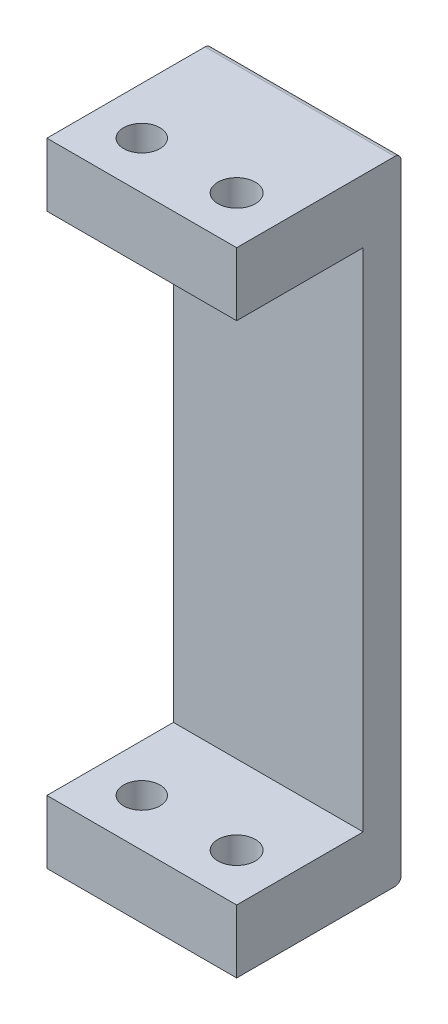
ISO-10303-21;
HEADER;
FILE_DESCRIPTION(('STEP AP214'),'2;1');
FILE_NAME('part.step','',(''),(''),'','','');
FILE_SCHEMA(('AUTOMOTIVE_DESIGN { 1 0 10303 214 1 1 1 1 }'));
ENDSEC;
DATA;
#1=APPLICATION_CONTEXT('core data for automotive mechanical design processes');
#2=APPLICATION_PROTOCOL_DEFINITION('international standard','automotive_design',2000,#1);
#3=PRODUCT_CONTEXT('',#1,'mechanical');
#4=PRODUCT('Part','Part','',(#3));
#5=PRODUCT_RELATED_PRODUCT_CATEGORY('part','',(#4));
#6=PRODUCT_DEFINITION_FORMATION('','',#4);
#7=PRODUCT_DEFINITION_CONTEXT('part definition',#1,'design');
#8=PRODUCT_DEFINITION('design','',#6,#7);
#9=PRODUCT_DEFINITION_SHAPE('','',#8);
#10=(LENGTH_UNIT() NAMED_UNIT(*) SI_UNIT(.MILLI.,.METRE.));
#11=(NAMED_UNIT(*) PLANE_ANGLE_UNIT() SI_UNIT($,.RADIAN.));
#12=(NAMED_UNIT(*) SI_UNIT($,.STERADIAN.) SOLID_ANGLE_UNIT());
#13=UNCERTAINTY_MEASURE_WITH_UNIT(LENGTH_MEASURE(1.E-05),#10,'distance_accuracy_value','');
#14=(GEOMETRIC_REPRESENTATION_CONTEXT(3) GLOBAL_UNCERTAINTY_ASSIGNED_CONTEXT((#13)) GLOBAL_UNIT_ASSIGNED_CONTEXT((#10,
#11,#12)) REPRESENTATION_CONTEXT('',''));
#15=CARTESIAN_POINT('',(0.,0.,0.));
#16=DIRECTION('',(0.,0.,1.));
#17=DIRECTION('',(1.,0.,0.));
#18=AXIS2_PLACEMENT_3D('',#15,#16,#17);
#19=CARTESIAN_POINT('',(0.,0.,30.));
#20=DIRECTION('',(1.,0.,0.));
#21=DIRECTION('',(0.,0.,-1.));
#22=AXIS2_PLACEMENT_3D('',#19,#20,#21);
#23=PLANE('',#22);
#24=DIRECTION('',(0.,0.,-1.));
#25=VECTOR('',#24,1.);
#26=CARTESIAN_POINT('',(0.,500.,30.));
#27=LINE('',#26,#25);
#28=CARTESIAN_POINT('',(0.,500.,130.));
#29=VERTEX_POINT('',#28);
#30=CARTESIAN_POINT('',(0.,500.,5.));
#31=VERTEX_POINT('',#30);
#32=EDGE_CURVE('E195',#29,#31,#27,.T.);
#33=ORIENTED_EDGE('',*,*,#32,.T.);
#34=CARTESIAN_POINT('',(0.,495.,5.));
#35=DIRECTION('',(1.,0.,0.));
#36=DIRECTION('',(0.,0.,-1.));
#37=AXIS2_PLACEMENT_3D('',#34,#35,#36);
#38=CIRCLE('',#37,5.);
#39=CARTESIAN_POINT('',(0.,495.,0.));
#40=VERTEX_POINT('',#39);
#41=EDGE_CURVE('E209',#31,#40,#38,.F.);
#42=ORIENTED_EDGE('',*,*,#41,.T.);
#43=DIRECTION('',(0.,-1.,0.));
#44=VECTOR('',#43,1.);
#45=CARTESIAN_POINT('',(0.,0.,0.));
#46=LINE('',#45,#44);
#47=CARTESIAN_POINT('',(0.,5.,0.));
#48=VERTEX_POINT('',#47);
#49=EDGE_CURVE('E189',#40,#48,#46,.T.);
#50=ORIENTED_EDGE('',*,*,#49,.T.);
#51=CARTESIAN_POINT('',(0.,5.,5.));
#52=DIRECTION('',(1.,0.,0.));
#53=DIRECTION('',(0.,0.,-1.));
#54=AXIS2_PLACEMENT_3D('',#51,#52,#53);
#55=CIRCLE('',#54,5.);
#56=CARTESIAN_POINT('',(0.,0.,5.));
#57=VERTEX_POINT('',#56);
#58=EDGE_CURVE('E207',#48,#57,#55,.F.);
#59=ORIENTED_EDGE('',*,*,#58,.T.);
#60=DIRECTION('',(0.,0.,-1.));
#61=VECTOR('',#60,1.);
#62=CARTESIAN_POINT('',(0.,0.,30.));
#63=LINE('',#62,#61);
#64=CARTESIAN_POINT('',(0.,0.,130.));
#65=VERTEX_POINT('',#64);
#66=EDGE_CURVE('E141',#65,#57,#63,.T.);
#67=ORIENTED_EDGE('',*,*,#66,.F.);
#68=DIRECTION('',(0.,1.,0.));
#69=VECTOR('',#68,1.);
#70=CARTESIAN_POINT('',(0.,0.,130.));
#71=LINE('',#70,#69);
#72=CARTESIAN_POINT('',(0.,50.,130.));
#73=VERTEX_POINT('',#72);
#74=EDGE_CURVE('E150',#65,#73,#71,.T.);
#75=ORIENTED_EDGE('',*,*,#74,.T.);
#76=DIRECTION('',(0.,0.,-1.));
#77=VECTOR('',#76,1.);
#78=CARTESIAN_POINT('',(0.,50.,130.));
#79=LINE('',#78,#77);
#80=CARTESIAN_POINT('',(0.,50.,30.));
#81=VERTEX_POINT('',#80);
#82=EDGE_CURVE('E157',#73,#81,#79,.T.);
#83=ORIENTED_EDGE('',*,*,#82,.T.);
#84=DIRECTION('',(0.,-1.,0.));
#85=VECTOR('',#84,1.);
#86=CARTESIAN_POINT('',(0.,0.,30.));
#87=LINE('',#86,#85);
#88=CARTESIAN_POINT('',(0.,450.,30.));
#89=VERTEX_POINT('',#88);
#90=EDGE_CURVE('E190',#89,#81,#87,.T.);
#91=ORIENTED_EDGE('',*,*,#90,.F.);
#92=DIRECTION('',(0.,0.,-1.));
#93=VECTOR('',#92,1.);
#94=CARTESIAN_POINT('',(0.,450.,130.));
#95=LINE('',#94,#93);
#96=CARTESIAN_POINT('',(0.,450.,130.));
#97=VERTEX_POINT('',#96);
#98=EDGE_CURVE('E170',#97,#89,#95,.T.);
#99=ORIENTED_EDGE('',*,*,#98,.F.);
#100=DIRECTION('',(0.,-1.,0.));
#101=VECTOR('',#100,1.);
#102=CARTESIAN_POINT('',(0.,500.,130.));
#103=LINE('',#102,#101);
#104=EDGE_CURVE('E176',#29,#97,#103,.T.);
#105=ORIENTED_EDGE('',*,*,#104,.F.);
#106=EDGE_LOOP('',(#33,#42,#50,#59,#67,#75,#83,#91,#99,#105));
#107=FACE_BOUND('',#106,.T.);
#108=ADVANCED_FACE('F52',(#107),#23,.F.);
#109=CARTESIAN_POINT('',(0.,0.,30.));
#110=DIRECTION('',(0.,1.,0.));
#111=DIRECTION('',(0.,0.,1.));
#112=AXIS2_PLACEMENT_3D('',#109,#110,#111);
#113=PLANE('',#112);
#114=CARTESIAN_POINT('',(37.5,0.,92.5));
#115=DIRECTION('',(0.,1.,0.));
#116=DIRECTION('',(0.,0.,1.));
#117=AXIS2_PLACEMENT_3D('',#114,#115,#116);
#118=CIRCLE('',#117,14.3831333743872);
#119=CARTESIAN_POINT('',(37.5,0.,106.883133374387));
#120=VERTEX_POINT('',#119);
#121=EDGE_CURVE('E218',#120,#120,#118,.T.);
#122=ORIENTED_EDGE('',*,*,#121,.T.);
#123=EDGE_LOOP('',(#122));
#124=FACE_BOUND('',#123,.T.);
#125=CARTESIAN_POINT('',(112.5,0.,92.5));
#126=DIRECTION('',(0.,1.,0.));
#127=DIRECTION('',(0.,0.,1.));
#128=AXIS2_PLACEMENT_3D('',#125,#126,#127);
#129=CIRCLE('',#128,14.8145596634897);
#130=CARTESIAN_POINT('',(112.5,0.,107.31455966349));
#131=VERTEX_POINT('',#130);
#132=EDGE_CURVE('E233',#131,#131,#129,.T.);
#133=ORIENTED_EDGE('',*,*,#132,.T.);
#134=EDGE_LOOP('',(#133));
#135=FACE_BOUND('',#134,.T.);
#136=ORIENTED_EDGE('',*,*,#66,.T.);
#137=DIRECTION('',(1.,0.,0.));
#138=VECTOR('',#137,1.);
#139=CARTESIAN_POINT('',(150.,0.,5.));
#140=LINE('',#139,#138);
#141=CARTESIAN_POINT('',(150.,0.,5.));
#142=VERTEX_POINT('',#141);
#143=EDGE_CURVE('E12',#57,#142,#140,.T.);
#144=ORIENTED_EDGE('',*,*,#143,.T.);
#145=DIRECTION('',(0.,0.,-1.));
#146=VECTOR('',#145,1.);
#147=CARTESIAN_POINT('',(150.,0.,30.));
#148=LINE('',#147,#146);
#149=CARTESIAN_POINT('',(150.,0.,130.));
#150=VERTEX_POINT('',#149);
#151=EDGE_CURVE('E133',#150,#142,#148,.T.);
#152=ORIENTED_EDGE('',*,*,#151,.F.);
#153=DIRECTION('',(-1.,0.,0.));
#154=VECTOR('',#153,1.);
#155=CARTESIAN_POINT('',(150.,0.,130.));
#156=LINE('',#155,#154);
#157=EDGE_CURVE('E137',#150,#65,#156,.T.);
#158=ORIENTED_EDGE('',*,*,#157,.T.);
#159=EDGE_LOOP('',(#136,#144,#152,#158));
#160=FACE_BOUND('',#159,.T.);
#161=ADVANCED_FACE('F136',(#124,#135,#160),#113,.F.);
#162=CARTESIAN_POINT('',(150.,0.,30.));
#163=DIRECTION('',(-1.,0.,0.));
#164=DIRECTION('',(0.,0.,1.));
#165=AXIS2_PLACEMENT_3D('',#162,#163,#164);
#166=PLANE('',#165);
#167=DIRECTION('',(0.,1.,0.));
#168=VECTOR('',#167,1.);
#169=CARTESIAN_POINT('',(150.,0.,0.));
#170=LINE('',#169,#168);
#171=CARTESIAN_POINT('',(150.,5.,0.));
#172=VERTEX_POINT('',#171);
#173=CARTESIAN_POINT('',(150.,495.,0.));
#174=VERTEX_POINT('',#173);
#175=EDGE_CURVE('E193',#172,#174,#170,.T.);
#176=ORIENTED_EDGE('',*,*,#175,.T.);
#177=CARTESIAN_POINT('',(150.,495.,5.));
#178=DIRECTION('',(-1.,0.,0.));
#179=DIRECTION('',(0.,0.,1.));
#180=AXIS2_PLACEMENT_3D('',#177,#178,#179);
#181=CIRCLE('',#180,5.);
#182=CARTESIAN_POINT('',(150.,500.,5.));
#183=VERTEX_POINT('',#182);
#184=EDGE_CURVE('E61',#174,#183,#181,.F.);
#185=ORIENTED_EDGE('',*,*,#184,.T.);
#186=DIRECTION('',(0.,0.,-1.));
#187=VECTOR('',#186,1.);
#188=CARTESIAN_POINT('',(150.,500.,30.));
#189=LINE('',#188,#187);
#190=CARTESIAN_POINT('',(150.,500.,130.));
#191=VERTEX_POINT('',#190);
#192=EDGE_CURVE('E142',#191,#183,#189,.T.);
#193=ORIENTED_EDGE('',*,*,#192,.F.);
#194=DIRECTION('',(0.,-1.,0.));
#195=VECTOR('',#194,1.);
#196=CARTESIAN_POINT('',(150.,500.,130.));
#197=LINE('',#196,#195);
#198=CARTESIAN_POINT('',(150.,450.,130.));
#199=VERTEX_POINT('',#198);
#200=EDGE_CURVE('E175',#191,#199,#197,.T.);
#201=ORIENTED_EDGE('',*,*,#200,.T.);
#202=DIRECTION('',(0.,0.,-1.));
#203=VECTOR('',#202,1.);
#204=CARTESIAN_POINT('',(150.,450.,130.));
#205=LINE('',#204,#203);
#206=CARTESIAN_POINT('',(150.,450.,30.));
#207=VERTEX_POINT('',#206);
#208=EDGE_CURVE('E172',#199,#207,#205,.T.);
#209=ORIENTED_EDGE('',*,*,#208,.T.);
#210=DIRECTION('',(0.,1.,0.));
#211=VECTOR('',#210,1.);
#212=CARTESIAN_POINT('',(150.,0.,30.));
#213=LINE('',#212,#211);
#214=CARTESIAN_POINT('',(150.,50.,30.));
#215=VERTEX_POINT('',#214);
#216=EDGE_CURVE('E192',#215,#207,#213,.T.);
#217=ORIENTED_EDGE('',*,*,#216,.F.);
#218=DIRECTION('',(0.,0.,-1.));
#219=VECTOR('',#218,1.);
#220=CARTESIAN_POINT('',(150.,50.,130.));
#221=LINE('',#220,#219);
#222=CARTESIAN_POINT('',(150.,50.,130.));
#223=VERTEX_POINT('',#222);
#224=EDGE_CURVE('E152',#223,#215,#221,.T.);
#225=ORIENTED_EDGE('',*,*,#224,.F.);
#226=DIRECTION('',(0.,1.,0.));
#227=VECTOR('',#226,1.);
#228=CARTESIAN_POINT('',(150.,0.,130.));
#229=LINE('',#228,#227);
#230=EDGE_CURVE('E147',#150,#223,#229,.T.);
#231=ORIENTED_EDGE('',*,*,#230,.F.);
#232=ORIENTED_EDGE('',*,*,#151,.T.);
#233=CARTESIAN_POINT('',(150.,5.,5.));
#234=DIRECTION('',(-1.,0.,0.));
#235=DIRECTION('',(0.,0.,1.));
#236=AXIS2_PLACEMENT_3D('',#233,#234,#235);
#237=CIRCLE('',#236,5.);
#238=EDGE_CURVE('E69',#142,#172,#237,.F.);
#239=ORIENTED_EDGE('',*,*,#238,.T.);
#240=EDGE_LOOP('',(#176,#185,#193,#201,#209,#217,#225,#231,#232,#239));
#241=FACE_BOUND('',#240,.T.);
#242=ADVANCED_FACE('F154',(#241),#166,.F.);
#243=CARTESIAN_POINT('',(0.,500.,30.));
#244=DIRECTION('',(0.,-1.,0.));
#245=DIRECTION('',(0.,0.,-1.));
#246=AXIS2_PLACEMENT_3D('',#243,#244,#245);
#247=PLANE('',#246);
#248=CARTESIAN_POINT('',(37.5,500.,92.5));
#249=DIRECTION('',(0.,1.,0.));
#250=DIRECTION('',(0.,0.,1.));
#251=AXIS2_PLACEMENT_3D('',#248,#249,#250);
#252=CIRCLE('',#251,14.3831333743872);
#253=CARTESIAN_POINT('',(37.5,500.,106.883133374387));
#254=VERTEX_POINT('',#253);
#255=EDGE_CURVE('E223',#254,#254,#252,.T.);
#256=ORIENTED_EDGE('',*,*,#255,.F.);
#257=EDGE_LOOP('',(#256));
#258=FACE_BOUND('',#257,.T.);
#259=CARTESIAN_POINT('',(112.5,500.,92.5));
#260=DIRECTION('',(0.,1.,0.));
#261=DIRECTION('',(0.,0.,1.));
#262=AXIS2_PLACEMENT_3D('',#259,#260,#261);
#263=CIRCLE('',#262,14.8145596634897);
#264=CARTESIAN_POINT('',(112.5,500.,107.31455966349));
#265=VERTEX_POINT('',#264);
#266=EDGE_CURVE('E228',#265,#265,#263,.T.);
#267=ORIENTED_EDGE('',*,*,#266,.F.);
#268=EDGE_LOOP('',(#267));
#269=FACE_BOUND('',#268,.T.);
#270=ORIENTED_EDGE('',*,*,#192,.T.);
#271=DIRECTION('',(-1.,0.,0.));
#272=VECTOR('',#271,1.);
#273=CARTESIAN_POINT('',(0.,500.,5.));
#274=LINE('',#273,#272);
#275=EDGE_CURVE('E204',#183,#31,#274,.T.);
#276=ORIENTED_EDGE('',*,*,#275,.T.);
#277=ORIENTED_EDGE('',*,*,#32,.F.);
#278=DIRECTION('',(-1.,0.,0.));
#279=VECTOR('',#278,1.);
#280=CARTESIAN_POINT('',(150.,500.,130.));
#281=LINE('',#280,#279);
#282=EDGE_CURVE('E183',#191,#29,#281,.T.);
#283=ORIENTED_EDGE('',*,*,#282,.F.);
#284=EDGE_LOOP('',(#270,#276,#277,#283));
#285=FACE_BOUND('',#284,.T.);
#286=ADVANCED_FACE('F273',(#258,#269,#285),#247,.F.);
#287=CARTESIAN_POINT('',(0.,0.,30.));
#288=DIRECTION('',(0.,0.,-1.));
#289=DIRECTION('',(-1.,0.,0.));
#290=AXIS2_PLACEMENT_3D('',#287,#288,#289);
#291=PLANE('',#290);
#292=ORIENTED_EDGE('',*,*,#90,.T.);
#293=DIRECTION('',(-1.,0.,0.));
#294=VECTOR('',#293,1.);
#295=CARTESIAN_POINT('',(150.,50.,30.));
#296=LINE('',#295,#294);
#297=EDGE_CURVE('E167',#215,#81,#296,.T.);
#298=ORIENTED_EDGE('',*,*,#297,.F.);
#299=ORIENTED_EDGE('',*,*,#216,.T.);
#300=DIRECTION('',(-1.,0.,0.));
#301=VECTOR('',#300,1.);
#302=CARTESIAN_POINT('',(150.,450.,30.));
#303=LINE('',#302,#301);
#304=EDGE_CURVE('E186',#207,#89,#303,.T.);
#305=ORIENTED_EDGE('',*,*,#304,.T.);
#306=EDGE_LOOP('',(#292,#298,#299,#305));
#307=FACE_BOUND('',#306,.T.);
#308=ADVANCED_FACE('F286',(#307),#291,.F.);
#309=CARTESIAN_POINT('',(0.,0.,0.));
#310=DIRECTION('',(0.,0.,-1.));
#311=DIRECTION('',(-1.,0.,0.));
#312=AXIS2_PLACEMENT_3D('',#309,#310,#311);
#313=PLANE('',#312);
#314=ORIENTED_EDGE('',*,*,#49,.F.);
#315=DIRECTION('',(-1.,0.,0.));
#316=VECTOR('',#315,1.);
#317=CARTESIAN_POINT('',(150.,495.,0.));
#318=LINE('',#317,#316);
#319=EDGE_CURVE('E76',#40,#174,#318,.F.);
#320=ORIENTED_EDGE('',*,*,#319,.T.);
#321=ORIENTED_EDGE('',*,*,#175,.F.);
#322=DIRECTION('',(1.,0.,0.));
#323=VECTOR('',#322,1.);
#324=CARTESIAN_POINT('',(0.,5.,0.));
#325=LINE('',#324,#323);
#326=EDGE_CURVE('E211',#172,#48,#325,.F.);
#327=ORIENTED_EDGE('',*,*,#326,.T.);
#328=EDGE_LOOP('',(#314,#320,#321,#327));
#329=FACE_BOUND('',#328,.T.);
#330=ADVANCED_FACE('F300',(#329),#313,.T.);
#331=CARTESIAN_POINT('',(150.,450.,130.));
#332=DIRECTION('',(0.,1.,0.));
#333=DIRECTION('',(0.,0.,1.));
#334=AXIS2_PLACEMENT_3D('',#331,#332,#333);
#335=PLANE('',#334);
#336=CARTESIAN_POINT('',(37.5,450.,92.5));
#337=DIRECTION('',(0.,1.,0.));
#338=DIRECTION('',(0.,0.,1.));
#339=AXIS2_PLACEMENT_3D('',#336,#337,#338);
#340=CIRCLE('',#339,14.3831333743872);
#341=CARTESIAN_POINT('',(37.5,450.,106.883133374387));
#342=VERTEX_POINT('',#341);
#343=EDGE_CURVE('E163',#342,#342,#340,.T.);
#344=ORIENTED_EDGE('',*,*,#343,.T.);
#345=EDGE_LOOP('',(#344));
#346=FACE_BOUND('',#345,.T.);
#347=CARTESIAN_POINT('',(112.5,450.,92.5));
#348=DIRECTION('',(0.,1.,0.));
#349=DIRECTION('',(0.,0.,1.));
#350=AXIS2_PLACEMENT_3D('',#347,#348,#349);
#351=CIRCLE('',#350,14.8145596634897);
#352=CARTESIAN_POINT('',(112.5,450.,107.31455966349));
#353=VERTEX_POINT('',#352);
#354=EDGE_CURVE('E217',#353,#353,#351,.T.);
#355=ORIENTED_EDGE('',*,*,#354,.T.);
#356=EDGE_LOOP('',(#355));
#357=FACE_BOUND('',#356,.T.);
#358=ORIENTED_EDGE('',*,*,#98,.T.);
#359=ORIENTED_EDGE('',*,*,#304,.F.);
#360=ORIENTED_EDGE('',*,*,#208,.F.);
#361=DIRECTION('',(-1.,0.,0.));
#362=VECTOR('',#361,1.);
#363=CARTESIAN_POINT('',(150.,450.,130.));
#364=LINE('',#363,#362);
#365=EDGE_CURVE('E178',#199,#97,#364,.T.);
#366=ORIENTED_EDGE('',*,*,#365,.T.);
#367=EDGE_LOOP('',(#358,#359,#360,#366));
#368=FACE_BOUND('',#367,.T.);
#369=ADVANCED_FACE('F282',(#346,#357,#368),#335,.F.);
#370=CARTESIAN_POINT('',(150.,500.,130.));
#371=DIRECTION('',(0.,0.,-1.));
#372=DIRECTION('',(-1.,0.,0.));
#373=AXIS2_PLACEMENT_3D('',#370,#371,#372);
#374=PLANE('',#373);
#375=ORIENTED_EDGE('',*,*,#104,.T.);
#376=ORIENTED_EDGE('',*,*,#365,.F.);
#377=ORIENTED_EDGE('',*,*,#200,.F.);
#378=ORIENTED_EDGE('',*,*,#282,.T.);
#379=EDGE_LOOP('',(#375,#376,#377,#378));
#380=FACE_BOUND('',#379,.T.);
#381=ADVANCED_FACE('F278',(#380),#374,.F.);
#382=CARTESIAN_POINT('',(150.,50.,130.));
#383=DIRECTION('',(0.,1.,0.));
#384=DIRECTION('',(0.,0.,1.));
#385=AXIS2_PLACEMENT_3D('',#382,#383,#384);
#386=PLANE('',#385);
#387=CARTESIAN_POINT('',(37.5,50.,92.5));
#388=DIRECTION('',(0.,1.,0.));
#389=DIRECTION('',(0.,0.,1.));
#390=AXIS2_PLACEMENT_3D('',#387,#388,#389);
#391=CIRCLE('',#390,14.3831333743872);
#392=CARTESIAN_POINT('',(37.5,50.,106.883133374387));
#393=VERTEX_POINT('',#392);
#394=EDGE_CURVE('E56',#393,#393,#391,.T.);
#395=ORIENTED_EDGE('',*,*,#394,.F.);
#396=EDGE_LOOP('',(#395));
#397=FACE_BOUND('',#396,.T.);
#398=CARTESIAN_POINT('',(112.5,50.,92.5));
#399=DIRECTION('',(0.,1.,0.));
#400=DIRECTION('',(0.,0.,1.));
#401=AXIS2_PLACEMENT_3D('',#398,#399,#400);
#402=CIRCLE('',#401,14.8145596634897);
#403=CARTESIAN_POINT('',(112.5,50.,107.31455966349));
#404=VERTEX_POINT('',#403);
#405=EDGE_CURVE('E215',#404,#404,#402,.T.);
#406=ORIENTED_EDGE('',*,*,#405,.F.);
#407=EDGE_LOOP('',(#406));
#408=FACE_BOUND('',#407,.T.);
#409=ORIENTED_EDGE('',*,*,#82,.F.);
#410=DIRECTION('',(-1.,0.,0.));
#411=VECTOR('',#410,1.);
#412=CARTESIAN_POINT('',(150.,50.,130.));
#413=LINE('',#412,#411);
#414=EDGE_CURVE('E151',#223,#73,#413,.T.);
#415=ORIENTED_EDGE('',*,*,#414,.F.);
#416=ORIENTED_EDGE('',*,*,#224,.T.);
#417=ORIENTED_EDGE('',*,*,#297,.T.);
#418=EDGE_LOOP('',(#409,#415,#416,#417));
#419=FACE_BOUND('',#418,.T.);
#420=ADVANCED_FACE('F267',(#397,#408,#419),#386,.T.);
#421=CARTESIAN_POINT('',(150.,0.,130.));
#422=DIRECTION('',(0.,0.,1.));
#423=DIRECTION('',(1.,0.,0.));
#424=AXIS2_PLACEMENT_3D('',#421,#422,#423);
#425=PLANE('',#424);
#426=ORIENTED_EDGE('',*,*,#74,.F.);
#427=ORIENTED_EDGE('',*,*,#157,.F.);
#428=ORIENTED_EDGE('',*,*,#230,.T.);
#429=ORIENTED_EDGE('',*,*,#414,.T.);
#430=EDGE_LOOP('',(#426,#427,#428,#429));
#431=FACE_BOUND('',#430,.T.);
#432=ADVANCED_FACE('F146',(#431),#425,.T.);
#433=CARTESIAN_POINT('',(0.,495.,5.));
#434=DIRECTION('',(1.,0.,0.));
#435=DIRECTION('',(0.,0.,-1.));
#436=AXIS2_PLACEMENT_3D('',#433,#434,#435);
#437=CYLINDRICAL_SURFACE('',#436,5.);
#438=ORIENTED_EDGE('',*,*,#184,.F.);
#439=ORIENTED_EDGE('',*,*,#319,.F.);
#440=ORIENTED_EDGE('',*,*,#41,.F.);
#441=ORIENTED_EDGE('',*,*,#275,.F.);
#442=EDGE_LOOP('',(#438,#439,#440,#441));
#443=FACE_BOUND('',#442,.T.);
#444=ADVANCED_FACE('F250',(#443),#437,.T.);
#445=CARTESIAN_POINT('',(0.,5.,5.));
#446=DIRECTION('',(-1.,0.,0.));
#447=DIRECTION('',(0.,0.,1.));
#448=AXIS2_PLACEMENT_3D('',#445,#446,#447);
#449=CYLINDRICAL_SURFACE('',#448,5.);
#450=ORIENTED_EDGE('',*,*,#58,.F.);
#451=ORIENTED_EDGE('',*,*,#326,.F.);
#452=ORIENTED_EDGE('',*,*,#238,.F.);
#453=ORIENTED_EDGE('',*,*,#143,.F.);
#454=EDGE_LOOP('',(#450,#451,#452,#453));
#455=FACE_BOUND('',#454,.T.);
#456=ADVANCED_FACE('F54',(#455),#449,.T.);
#457=CARTESIAN_POINT('',(112.5,0.,92.5));
#458=DIRECTION('',(0.,1.,0.));
#459=DIRECTION('',(0.,0.,1.));
#460=AXIS2_PLACEMENT_3D('',#457,#458,#459);
#461=CYLINDRICAL_SURFACE('',#460,14.8145596634897);
#462=ORIENTED_EDGE('',*,*,#405,.T.);
#463=EDGE_LOOP('',(#462));
#464=FACE_BOUND('',#463,.T.);
#465=ORIENTED_EDGE('',*,*,#132,.F.);
#466=EDGE_LOOP('',(#465));
#467=FACE_BOUND('',#466,.T.);
#468=ADVANCED_FACE('F238',(#464,#467),#461,.F.);
#469=CARTESIAN_POINT('',(37.5,0.,92.5));
#470=DIRECTION('',(0.,1.,0.));
#471=DIRECTION('',(0.,0.,1.));
#472=AXIS2_PLACEMENT_3D('',#469,#470,#471);
#473=CYLINDRICAL_SURFACE('',#472,14.3831333743872);
#474=ORIENTED_EDGE('',*,*,#394,.T.);
#475=EDGE_LOOP('',(#474));
#476=FACE_BOUND('',#475,.T.);
#477=ORIENTED_EDGE('',*,*,#121,.F.);
#478=EDGE_LOOP('',(#477));
#479=FACE_BOUND('',#478,.T.);
#480=ADVANCED_FACE('F240',(#476,#479),#473,.F.);
#481=ORIENTED_EDGE('',*,*,#266,.T.);
#482=EDGE_LOOP('',(#481));
#483=FACE_BOUND('',#482,.T.);
#484=ORIENTED_EDGE('',*,*,#354,.F.);
#485=EDGE_LOOP('',(#484));
#486=FACE_BOUND('',#485,.T.);
#487=ADVANCED_FACE('F242',(#483,#486),#461,.F.);
#488=ORIENTED_EDGE('',*,*,#255,.T.);
#489=EDGE_LOOP('',(#488));
#490=FACE_BOUND('',#489,.T.);
#491=ORIENTED_EDGE('',*,*,#343,.F.);
#492=EDGE_LOOP('',(#491));
#493=FACE_BOUND('',#492,.T.);
#494=ADVANCED_FACE('F249',(#490,#493),#473,.F.);
#495=CLOSED_SHELL('',(#108,#161,#242,#286,#308,#330,#369,#381,#420,#432,#444,#456,#468,#480,
#487,#494));
#496=MANIFOLD_SOLID_BREP('B2',#495);
#497=ADVANCED_BREP_SHAPE_REPRESENTATION('',(#18,#496),#14);
#498=SHAPE_DEFINITION_REPRESENTATION(#9,#497);
ENDSEC;
END-ISO-10303-21;
